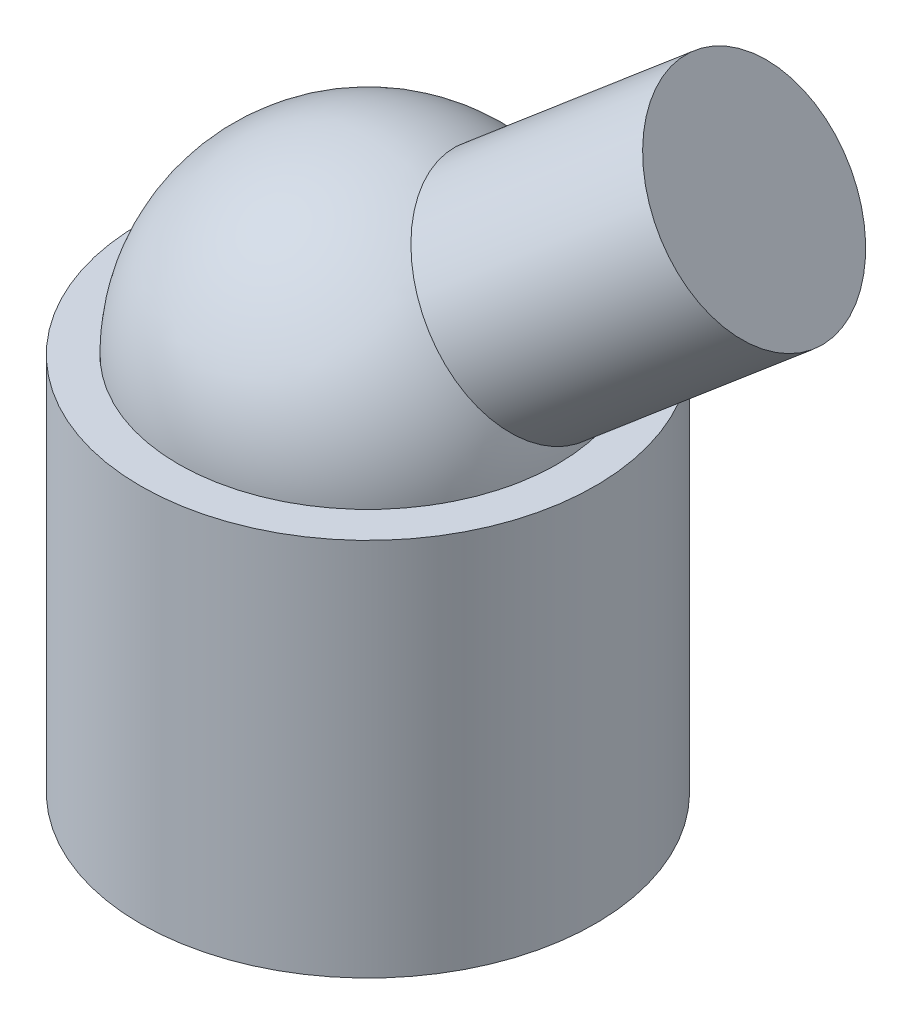
ISO-10303-21;
HEADER;
FILE_DESCRIPTION(('STEP AP214'),'2;1');
FILE_NAME('part.step','',(''),(''),'','','');
FILE_SCHEMA(('AUTOMOTIVE_DESIGN { 1 0 10303 214 1 1 1 1 }'));
ENDSEC;
DATA;
#1=APPLICATION_CONTEXT('core data for automotive mechanical design processes');
#2=APPLICATION_PROTOCOL_DEFINITION('international standard','automotive_design',2000,#1);
#3=PRODUCT_CONTEXT('',#1,'mechanical');
#4=PRODUCT('Part','Part','',(#3));
#5=PRODUCT_RELATED_PRODUCT_CATEGORY('part','',(#4));
#6=PRODUCT_DEFINITION_FORMATION('','',#4);
#7=PRODUCT_DEFINITION_CONTEXT('part definition',#1,'design');
#8=PRODUCT_DEFINITION('design','',#6,#7);
#9=PRODUCT_DEFINITION_SHAPE('','',#8);
#10=(LENGTH_UNIT() NAMED_UNIT(*) SI_UNIT(.MILLI.,.METRE.));
#11=(NAMED_UNIT(*) PLANE_ANGLE_UNIT() SI_UNIT($,.RADIAN.));
#12=(NAMED_UNIT(*) SI_UNIT($,.STERADIAN.) SOLID_ANGLE_UNIT());
#13=UNCERTAINTY_MEASURE_WITH_UNIT(LENGTH_MEASURE(1.E-05),#10,'distance_accuracy_value','');
#14=(GEOMETRIC_REPRESENTATION_CONTEXT(3) GLOBAL_UNCERTAINTY_ASSIGNED_CONTEXT((#13)) GLOBAL_UNIT_ASSIGNED_CONTEXT((#10,
#11,#12)) REPRESENTATION_CONTEXT('',''));
#15=CARTESIAN_POINT('',(0.,0.,0.));
#16=DIRECTION('',(0.,0.,1.));
#17=DIRECTION('',(1.,0.,0.));
#18=AXIS2_PLACEMENT_3D('',#15,#16,#17);
#19=CARTESIAN_POINT('',(12.0355419396809,50.8651470590792,55.2224365780812));
#20=DIRECTION('',(0.,-1.,0.));
#21=DIRECTION('',(0.,0.,-1.));
#22=AXIS2_PLACEMENT_3D('',#19,#20,#21);
#23=CYLINDRICAL_SURFACE('',#22,25.);
#24=CARTESIAN_POINT('',(12.0355419396809,50.8651470590792,55.2224365780812));
#25=DIRECTION('',(0.,1.,0.));
#26=DIRECTION('',(0.,0.,1.));
#27=AXIS2_PLACEMENT_3D('',#24,#25,#26);
#28=CIRCLE('',#27,25.);
#29=CARTESIAN_POINT('',(12.0355419396809,50.8651470590792,80.2224365780812));
#30=VERTEX_POINT('',#29);
#31=EDGE_CURVE('P0_E26',#30,#30,#28,.T.);
#32=ORIENTED_EDGE('',*,*,#31,.T.);
#33=EDGE_LOOP('',(#32));
#34=FACE_BOUND('',#33,.T.);
#35=CARTESIAN_POINT('',(12.0355419396809,10.8651470590792,55.2224365780812));
#36=DIRECTION('',(0.,-1.,0.));
#37=DIRECTION('',(0.,0.,-1.));
#38=AXIS2_PLACEMENT_3D('',#35,#36,#37);
#39=CIRCLE('',#38,25.);
#40=CARTESIAN_POINT('',(12.0355419396809,10.8651470590792,30.2224365780812));
#41=VERTEX_POINT('',#40);
#42=EDGE_CURVE('P0_E30',#41,#41,#39,.T.);
#43=ORIENTED_EDGE('',*,*,#42,.T.);
#44=EDGE_LOOP('',(#43));
#45=FACE_BOUND('',#44,.T.);
#46=ADVANCED_FACE('P0_F15',(#34,#45),#23,.F.);
#47=CARTESIAN_POINT('',(12.0355419396809,50.8651470590792,55.2224365780812));
#48=DIRECTION('',(0.,1.,0.));
#49=DIRECTION('',(0.,0.,1.));
#50=AXIS2_PLACEMENT_3D('',#47,#48,#49);
#51=PLANE('',#50);
#52=CARTESIAN_POINT('',(12.0355419396809,50.8651470590792,55.2224365780812));
#53=DIRECTION('',(0.,1.,0.));
#54=DIRECTION('',(0.,0.,1.));
#55=AXIS2_PLACEMENT_3D('',#52,#53,#54);
#56=CIRCLE('',#55,30.);
#57=CARTESIAN_POINT('',(12.0355419396809,50.8651470590792,85.2224365780812));
#58=VERTEX_POINT('',#57);
#59=EDGE_CURVE('P0_E10',#58,#58,#56,.T.);
#60=ORIENTED_EDGE('',*,*,#59,.T.);
#61=EDGE_LOOP('',(#60));
#62=FACE_BOUND('',#61,.T.);
#63=ORIENTED_EDGE('',*,*,#31,.F.);
#64=EDGE_LOOP('',(#63));
#65=FACE_BOUND('',#64,.T.);
#66=ADVANCED_FACE('P0_F46',(#62,#65),#51,.T.);
#67=CARTESIAN_POINT('',(12.0355419396809,0.865147059079186,55.2224365780812));
#68=DIRECTION('',(0.,1.,0.));
#69=DIRECTION('',(0.,0.,1.));
#70=AXIS2_PLACEMENT_3D('',#67,#68,#69);
#71=PLANE('',#70);
#72=CARTESIAN_POINT('',(12.0355419396809,0.865147059079186,55.2224365780812));
#73=DIRECTION('',(0.,1.,0.));
#74=DIRECTION('',(0.,0.,1.));
#75=AXIS2_PLACEMENT_3D('',#72,#73,#74);
#76=CIRCLE('',#75,30.);
#77=CARTESIAN_POINT('',(12.0355419396809,0.865147059079186,85.2224365780812));
#78=VERTEX_POINT('',#77);
#79=EDGE_CURVE('P0_E19',#78,#78,#76,.T.);
#80=ORIENTED_EDGE('',*,*,#79,.F.);
#81=EDGE_LOOP('',(#80));
#82=FACE_BOUND('',#81,.T.);
#83=ADVANCED_FACE('P0_F42',(#82),#71,.F.);
#84=CARTESIAN_POINT('',(12.0355419396809,50.8651470590792,55.2224365780812));
#85=DIRECTION('',(0.,-1.,0.));
#86=DIRECTION('',(0.,0.,-1.));
#87=AXIS2_PLACEMENT_3D('',#84,#85,#86);
#88=CYLINDRICAL_SURFACE('',#87,30.);
#89=ORIENTED_EDGE('',*,*,#59,.F.);
#90=EDGE_LOOP('',(#89));
#91=FACE_BOUND('',#90,.T.);
#92=ORIENTED_EDGE('',*,*,#79,.T.);
#93=EDGE_LOOP('',(#92));
#94=FACE_BOUND('',#93,.T.);
#95=ADVANCED_FACE('P0_F17',(#91,#94),#88,.T.);
#96=CARTESIAN_POINT('',(12.0355419396809,10.8651470590792,55.2224365780812));
#97=DIRECTION('',(0.,-1.,0.));
#98=DIRECTION('',(0.,0.,-1.));
#99=AXIS2_PLACEMENT_3D('',#96,#97,#98);
#100=PLANE('',#99);
#101=ORIENTED_EDGE('',*,*,#42,.F.);
#102=EDGE_LOOP('',(#101));
#103=FACE_BOUND('',#102,.T.);
#104=ADVANCED_FACE('P0_F35',(#103),#100,.F.);
#105=CLOSED_SHELL('',(#46,#66,#83,#95,#104));
#106=MANIFOLD_SOLID_BREP('P0_B1',#105);
#107=CARTESIAN_POINT('',(12.0355419396668,50.8651470590613,55.2224365781008));
#108=DIRECTION('',(0.655142700456248,-0.681584257091342,0.32593088611566));
#109=DIRECTION('',(-0.755337441486889,-0.599999999999923,0.26356279989432));
#110=AXIS2_PLACEMENT_3D('',#107,#108,#109);
#111=SPHERICAL_SURFACE('',#110,25.);
#112=CARTESIAN_POINT('',(12.0355419396668,50.8651470590613,55.2224365781008));
#113=DIRECTION('',(-0.755337441486889,-0.599999999999923,0.26356279989432));
#114=DIRECTION('',(0.0159182765064865,-0.418859046082731,-0.907911729182814));
#115=AXIS2_PLACEMENT_3D('',#112,#113,#114);
#116=SPHERICAL_SURFACE('',#115,25.);
#117=CARTESIAN_POINT('',(27.1422907694045,62.8651470590598,49.9511805802144));
#118=DIRECTION('',(-0.755337441486889,-0.599999999999923,0.26356279989432));
#119=DIRECTION('',(0.0159182765064865,-0.418859046082731,-0.907911729182814));
#120=AXIS2_PLACEMENT_3D('',#117,#118,#119);
#121=CIRCLE('',#120,15.);
#122=CARTESIAN_POINT('',(27.3810649170018,56.5822613678188,36.3325046424722));
#123=VERTEX_POINT('',#122);
#124=EDGE_CURVE('P1_E9',#123,#123,#121,.F.);
#125=ORIENTED_EDGE('',*,*,#124,.F.);
#126=EDGE_LOOP('',(#125));
#127=FACE_BOUND('',#126,.T.);
#128=ADVANCED_FACE('P1_F14',(#127),#116,.T.);
#129=CARTESIAN_POINT('',(-6.84940477238844,35.8639470590632,61.8120337010586));
#130=DIRECTION('',(0.755337441486889,0.599999999999923,-0.26356279989432));
#131=DIRECTION('',(-0.0159182765064865,0.418859046082731,0.907911729182814));
#132=AXIS2_PLACEMENT_3D('',#129,#130,#131);
#133=CYLINDRICAL_SURFACE('',#132,15.);
#134=ORIENTED_EDGE('',*,*,#124,.T.);
#135=EDGE_LOOP('',(#134));
#136=FACE_BOUND('',#135,.T.);
#137=CARTESIAN_POINT('',(49.8024140140112,80.8651470590575,42.0442965833848));
#138=DIRECTION('',(0.755337441486889,0.599999999999923,-0.26356279989432));
#139=DIRECTION('',(-0.0159182765064865,0.418859046082731,0.907911729182814));
#140=AXIS2_PLACEMENT_3D('',#137,#138,#139);
#141=CIRCLE('',#140,15.);
#142=CARTESIAN_POINT('',(49.5636398664139,87.1480327502984,55.662972521127));
#143=VERTEX_POINT('',#142);
#144=EDGE_CURVE('P1_E20',#143,#143,#141,.T.);
#145=ORIENTED_EDGE('',*,*,#144,.F.);
#146=EDGE_LOOP('',(#145));
#147=FACE_BOUND('',#146,.T.);
#148=ADVANCED_FACE('P1_F28',(#136,#147),#133,.T.);
#149=CARTESIAN_POINT('',(49.8024140140112,80.8651470590575,42.0442965833848));
#150=DIRECTION('',(0.755337441486889,0.599999999999923,-0.26356279989432));
#151=DIRECTION('',(-0.0159182765064865,0.418859046082731,0.907911729182814));
#152=AXIS2_PLACEMENT_3D('',#149,#150,#151);
#153=PLANE('',#152);
#154=ORIENTED_EDGE('',*,*,#144,.T.);
#155=EDGE_LOOP('',(#154));
#156=FACE_BOUND('',#155,.T.);
#157=ADVANCED_FACE('P1_F26',(#156),#153,.T.);
#158=CLOSED_SHELL('',(#128,#148,#157));
#159=MANIFOLD_SOLID_BREP('P1_B1',#158);
#160=ADVANCED_BREP_SHAPE_REPRESENTATION('',(#18,#106,#159),#14);
#161=SHAPE_DEFINITION_REPRESENTATION(#9,#160);
ENDSEC;
END-ISO-10303-21;
